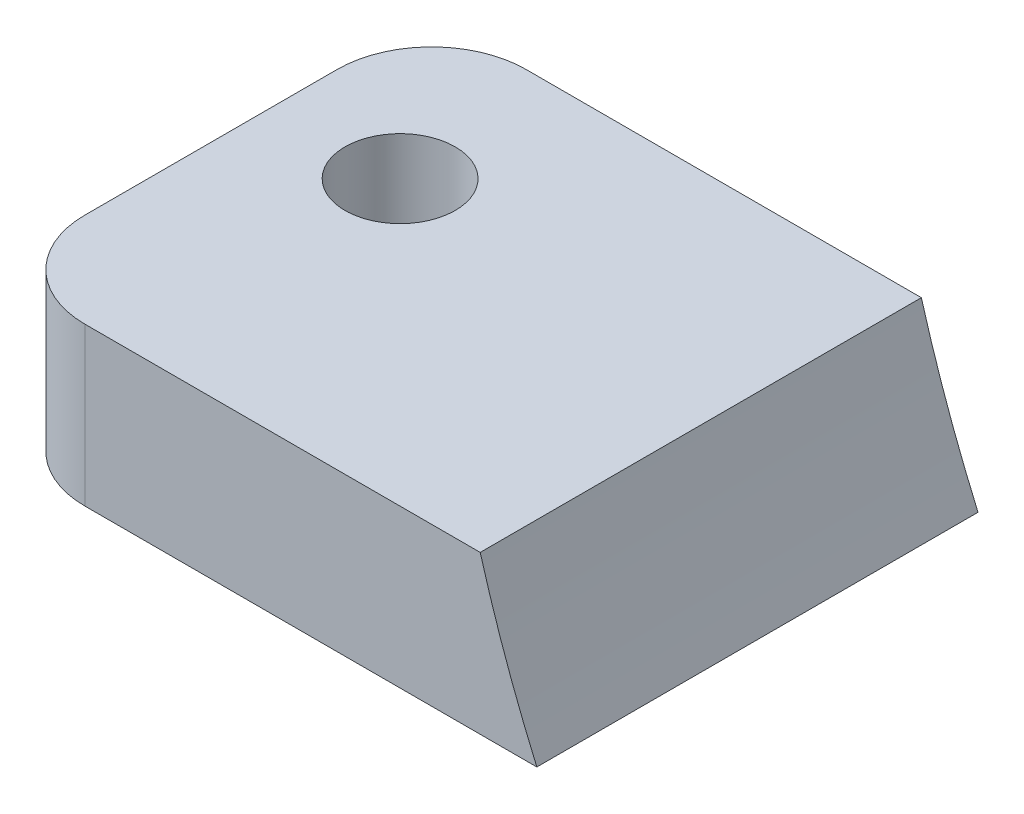
ISO-10303-21;
HEADER;
FILE_DESCRIPTION(('STEP AP214'),'2;1');
FILE_NAME('part.step','',(''),(''),'','','');
FILE_SCHEMA(('AUTOMOTIVE_DESIGN { 1 0 10303 214 1 1 1 1 }'));
ENDSEC;
DATA;
#1=APPLICATION_CONTEXT('core data for automotive mechanical design processes');
#2=APPLICATION_PROTOCOL_DEFINITION('international standard','automotive_design',2000,#1);
#3=PRODUCT_CONTEXT('',#1,'mechanical');
#4=PRODUCT('Part','Part','',(#3));
#5=PRODUCT_RELATED_PRODUCT_CATEGORY('part','',(#4));
#6=PRODUCT_DEFINITION_FORMATION('','',#4);
#7=PRODUCT_DEFINITION_CONTEXT('part definition',#1,'design');
#8=PRODUCT_DEFINITION('design','',#6,#7);
#9=PRODUCT_DEFINITION_SHAPE('','',#8);
#10=(LENGTH_UNIT() NAMED_UNIT(*) SI_UNIT(.MILLI.,.METRE.));
#11=(NAMED_UNIT(*) PLANE_ANGLE_UNIT() SI_UNIT($,.RADIAN.));
#12=(NAMED_UNIT(*) SI_UNIT($,.STERADIAN.) SOLID_ANGLE_UNIT());
#13=UNCERTAINTY_MEASURE_WITH_UNIT(LENGTH_MEASURE(1.E-05),#10,'distance_accuracy_value','');
#14=(GEOMETRIC_REPRESENTATION_CONTEXT(3) GLOBAL_UNCERTAINTY_ASSIGNED_CONTEXT((#13)) GLOBAL_UNIT_ASSIGNED_CONTEXT((#10,
#11,#12)) REPRESENTATION_CONTEXT('',''));
#15=CARTESIAN_POINT('',(0.,0.,0.));
#16=DIRECTION('',(0.,0.,1.));
#17=DIRECTION('',(1.,0.,0.));
#18=AXIS2_PLACEMENT_3D('',#15,#16,#17);
#19=CARTESIAN_POINT('',(0.,0.,0.));
#20=DIRECTION('',(0.,0.,1.));
#21=DIRECTION('',(1.,0.,0.));
#22=AXIS2_PLACEMENT_3D('',#19,#20,#21);
#23=PLANE('',#22);
#24=DIRECTION('',(-1.,0.,0.));
#25=VECTOR('',#24,1.);
#26=CARTESIAN_POINT('',(72.001,-11.,0.));
#27=LINE('',#26,#25);
#28=CARTESIAN_POINT('',(-38.4577690460588,-11.,0.));
#29=VERTEX_POINT('',#28);
#30=CARTESIAN_POINT('',(-51.,-11.,0.));
#31=VERTEX_POINT('',#30);
#32=EDGE_CURVE('E110',#29,#31,#27,.T.);
#33=ORIENTED_EDGE('',*,*,#32,.F.);
#34=CARTESIAN_POINT('',(0.,0.,0.));
#35=DIRECTION('',(0.,0.,1.));
#36=DIRECTION('',(1.,0.,0.));
#37=AXIS2_PLACEMENT_3D('',#34,#35,#36);
#38=CIRCLE('',#37,40.);
#39=CARTESIAN_POINT('',(-36.6606055596467,-16.,0.));
#40=VERTEX_POINT('',#39);
#41=EDGE_CURVE('E94',#29,#40,#38,.T.);
#42=ORIENTED_EDGE('',*,*,#41,.T.);
#43=DIRECTION('',(-1.,0.,0.));
#44=VECTOR('',#43,1.);
#45=CARTESIAN_POINT('',(72.001,-16.,0.));
#46=LINE('',#45,#44);
#47=CARTESIAN_POINT('',(-51.,-16.,0.));
#48=VERTEX_POINT('',#47);
#49=EDGE_CURVE('E107',#40,#48,#46,.T.);
#50=ORIENTED_EDGE('',*,*,#49,.T.);
#51=DIRECTION('',(0.,1.,0.));
#52=VECTOR('',#51,1.);
#53=CARTESIAN_POINT('',(-51.,0.,0.));
#54=LINE('',#53,#52);
#55=EDGE_CURVE('E124',#48,#31,#54,.T.);
#56=ORIENTED_EDGE('',*,*,#55,.T.);
#57=EDGE_LOOP('',(#33,#42,#50,#56));
#58=FACE_BOUND('',#57,.T.);
#59=ADVANCED_FACE('F37',(#58),#23,.F.);
#60=CARTESIAN_POINT('',(72.001,-11.,14.));
#61=DIRECTION('',(0.,0.,-1.));
#62=DIRECTION('',(0.,1.,0.));
#63=AXIS2_PLACEMENT_3D('',#60,#61,#62);
#64=PLANE('',#63);
#65=DIRECTION('',(-1.,0.,0.));
#66=VECTOR('',#65,1.);
#67=CARTESIAN_POINT('',(72.001,-11.,14.));
#68=LINE('',#67,#66);
#69=CARTESIAN_POINT('',(-38.4577690460588,-11.,14.));
#70=VERTEX_POINT('',#69);
#71=CARTESIAN_POINT('',(-51.,-11.,14.));
#72=VERTEX_POINT('',#71);
#73=EDGE_CURVE('E118',#70,#72,#68,.T.);
#74=ORIENTED_EDGE('',*,*,#73,.T.);
#75=DIRECTION('',(0.,-1.,0.));
#76=VECTOR('',#75,1.);
#77=CARTESIAN_POINT('',(-51.,-11.,14.));
#78=LINE('',#77,#76);
#79=CARTESIAN_POINT('',(-51.,-16.,14.));
#80=VERTEX_POINT('',#79);
#81=EDGE_CURVE('E11',#72,#80,#78,.T.);
#82=ORIENTED_EDGE('',*,*,#81,.T.);
#83=DIRECTION('',(-1.,0.,0.));
#84=VECTOR('',#83,1.);
#85=CARTESIAN_POINT('',(72.001,-16.,14.));
#86=LINE('',#85,#84);
#87=CARTESIAN_POINT('',(-36.6606055596467,-16.,14.));
#88=VERTEX_POINT('',#87);
#89=EDGE_CURVE('E102',#88,#80,#86,.T.);
#90=ORIENTED_EDGE('',*,*,#89,.F.);
#91=CARTESIAN_POINT('',(0.,0.,14.));
#92=DIRECTION('',(0.,0.,-1.));
#93=DIRECTION('',(0.,1.,0.));
#94=AXIS2_PLACEMENT_3D('',#91,#92,#93);
#95=CIRCLE('',#94,40.);
#96=EDGE_CURVE('E97',#70,#88,#95,.F.);
#97=ORIENTED_EDGE('',*,*,#96,.F.);
#98=EDGE_LOOP('',(#74,#82,#90,#97));
#99=FACE_BOUND('',#98,.T.);
#100=ADVANCED_FACE('F145',(#99),#64,.F.);
#101=CARTESIAN_POINT('',(72.001,-16.,14.));
#102=DIRECTION('',(0.,1.,0.));
#103=DIRECTION('',(0.,0.,1.));
#104=AXIS2_PLACEMENT_3D('',#101,#102,#103);
#105=PLANE('',#104);
#106=CARTESIAN_POINT('',(-50.,-16.,5.));
#107=DIRECTION('',(0.,-1.,0.));
#108=DIRECTION('',(0.,0.,-1.));
#109=AXIS2_PLACEMENT_3D('',#106,#107,#108);
#110=CIRCLE('',#109,1.75);
#111=CARTESIAN_POINT('',(-50.,-16.,3.25));
#112=VERTEX_POINT('',#111);
#113=EDGE_CURVE('E112',#112,#112,#110,.T.);
#114=ORIENTED_EDGE('',*,*,#113,.F.);
#115=EDGE_LOOP('',(#114));
#116=FACE_BOUND('',#115,.T.);
#117=DIRECTION('',(0.,0.,-1.));
#118=VECTOR('',#117,1.);
#119=CARTESIAN_POINT('',(-54.,-16.,14.));
#120=LINE('',#119,#118);
#121=CARTESIAN_POINT('',(-54.,-16.,11.));
#122=VERTEX_POINT('',#121);
#123=CARTESIAN_POINT('',(-54.,-16.,3.));
#124=VERTEX_POINT('',#123);
#125=EDGE_CURVE('E133',#122,#124,#120,.T.);
#126=ORIENTED_EDGE('',*,*,#125,.T.);
#127=CARTESIAN_POINT('',(-51.,-16.,3.));
#128=DIRECTION('',(0.,1.,0.));
#129=DIRECTION('',(0.,0.,1.));
#130=AXIS2_PLACEMENT_3D('',#127,#128,#129);
#131=CIRCLE('',#130,3.);
#132=EDGE_CURVE('E45',#124,#48,#131,.F.);
#133=ORIENTED_EDGE('',*,*,#132,.T.);
#134=ORIENTED_EDGE('',*,*,#49,.F.);
#135=DIRECTION('',(0.,0.,-1.));
#136=VECTOR('',#135,1.);
#137=CARTESIAN_POINT('',(-36.6606055596467,-16.,200.));
#138=LINE('',#137,#136);
#139=EDGE_CURVE('E91',#88,#40,#138,.T.);
#140=ORIENTED_EDGE('',*,*,#139,.F.);
#141=ORIENTED_EDGE('',*,*,#89,.T.);
#142=CARTESIAN_POINT('',(-51.,-16.,11.));
#143=DIRECTION('',(0.,1.,0.));
#144=DIRECTION('',(0.,0.,1.));
#145=AXIS2_PLACEMENT_3D('',#142,#143,#144);
#146=CIRCLE('',#145,3.);
#147=EDGE_CURVE('E52',#80,#122,#146,.F.);
#148=ORIENTED_EDGE('',*,*,#147,.T.);
#149=EDGE_LOOP('',(#126,#133,#134,#140,#141,#148));
#150=FACE_BOUND('',#149,.T.);
#151=ADVANCED_FACE('F114',(#116,#150),#105,.F.);
#152=CARTESIAN_POINT('',(72.001,-11.,14.));
#153=DIRECTION('',(0.,-1.,0.));
#154=DIRECTION('',(0.,0.,-1.));
#155=AXIS2_PLACEMENT_3D('',#152,#153,#154);
#156=PLANE('',#155);
#157=CARTESIAN_POINT('',(-50.,-11.,5.));
#158=DIRECTION('',(0.,-1.,0.));
#159=DIRECTION('',(0.,0.,-1.));
#160=AXIS2_PLACEMENT_3D('',#157,#158,#159);
#161=CIRCLE('',#160,1.75);
#162=CARTESIAN_POINT('',(-50.,-11.,3.25));
#163=VERTEX_POINT('',#162);
#164=EDGE_CURVE('E137',#163,#163,#161,.T.);
#165=ORIENTED_EDGE('',*,*,#164,.T.);
#166=EDGE_LOOP('',(#165));
#167=FACE_BOUND('',#166,.T.);
#168=ORIENTED_EDGE('',*,*,#32,.T.);
#169=CARTESIAN_POINT('',(-51.,-11.,3.));
#170=DIRECTION('',(0.,-1.,0.));
#171=DIRECTION('',(0.,0.,-1.));
#172=AXIS2_PLACEMENT_3D('',#169,#170,#171);
#173=CIRCLE('',#172,3.);
#174=CARTESIAN_POINT('',(-54.,-11.,3.));
#175=VERTEX_POINT('',#174);
#176=EDGE_CURVE('E128',#31,#175,#173,.F.);
#177=ORIENTED_EDGE('',*,*,#176,.T.);
#178=DIRECTION('',(0.,0.,1.));
#179=VECTOR('',#178,1.);
#180=CARTESIAN_POINT('',(-54.,-11.,14.));
#181=LINE('',#180,#179);
#182=CARTESIAN_POINT('',(-54.,-11.,11.));
#183=VERTEX_POINT('',#182);
#184=EDGE_CURVE('E136',#175,#183,#181,.T.);
#185=ORIENTED_EDGE('',*,*,#184,.T.);
#186=CARTESIAN_POINT('',(-51.,-11.,11.));
#187=DIRECTION('',(0.,-1.,0.));
#188=DIRECTION('',(0.,0.,-1.));
#189=AXIS2_PLACEMENT_3D('',#186,#187,#188);
#190=CIRCLE('',#189,3.);
#191=EDGE_CURVE('E126',#183,#72,#190,.F.);
#192=ORIENTED_EDGE('',*,*,#191,.T.);
#193=ORIENTED_EDGE('',*,*,#73,.F.);
#194=DIRECTION('',(0.,0.,-1.));
#195=VECTOR('',#194,1.);
#196=CARTESIAN_POINT('',(-38.4577690460588,-11.0000000000001,200.));
#197=LINE('',#196,#195);
#198=EDGE_CURVE('E122',#29,#70,#197,.F.);
#199=ORIENTED_EDGE('',*,*,#198,.F.);
#200=EDGE_LOOP('',(#168,#177,#185,#192,#193,#199));
#201=FACE_BOUND('',#200,.T.);
#202=ADVANCED_FACE('F143',(#167,#201),#156,.F.);
#203=CARTESIAN_POINT('',(-54.,0.,0.));
#204=DIRECTION('',(1.,0.,0.));
#205=DIRECTION('',(0.,0.,-1.));
#206=AXIS2_PLACEMENT_3D('',#203,#204,#205);
#207=PLANE('',#206);
#208=ORIENTED_EDGE('',*,*,#184,.F.);
#209=DIRECTION('',(0.,1.,0.));
#210=VECTOR('',#209,1.);
#211=CARTESIAN_POINT('',(-54.,0.,3.));
#212=LINE('',#211,#210);
#213=EDGE_CURVE('E59',#175,#124,#212,.F.);
#214=ORIENTED_EDGE('',*,*,#213,.T.);
#215=ORIENTED_EDGE('',*,*,#125,.F.);
#216=DIRECTION('',(0.,-1.,0.));
#217=VECTOR('',#216,1.);
#218=CARTESIAN_POINT('',(-54.,0.,11.));
#219=LINE('',#218,#217);
#220=EDGE_CURVE('E130',#122,#183,#219,.F.);
#221=ORIENTED_EDGE('',*,*,#220,.T.);
#222=EDGE_LOOP('',(#208,#214,#215,#221));
#223=FACE_BOUND('',#222,.T.);
#224=ADVANCED_FACE('F134',(#223),#207,.F.);
#225=CARTESIAN_POINT('',(-50.,20.9497474683059,4.99999999999999));
#226=DIRECTION('',(0.,-1.,0.));
#227=DIRECTION('',(0.,0.,-1.));
#228=AXIS2_PLACEMENT_3D('',#225,#226,#227);
#229=CYLINDRICAL_SURFACE('',#228,1.75);
#230=ORIENTED_EDGE('',*,*,#113,.T.);
#231=EDGE_LOOP('',(#230));
#232=FACE_BOUND('',#231,.T.);
#233=ORIENTED_EDGE('',*,*,#164,.F.);
#234=EDGE_LOOP('',(#233));
#235=FACE_BOUND('',#234,.T.);
#236=ADVANCED_FACE('F154',(#232,#235),#229,.F.);
#237=CARTESIAN_POINT('',(-51.,0.,3.));
#238=DIRECTION('',(0.,1.,0.));
#239=DIRECTION('',(0.,0.,1.));
#240=AXIS2_PLACEMENT_3D('',#237,#238,#239);
#241=CYLINDRICAL_SURFACE('',#240,3.);
#242=ORIENTED_EDGE('',*,*,#132,.F.);
#243=ORIENTED_EDGE('',*,*,#213,.F.);
#244=ORIENTED_EDGE('',*,*,#176,.F.);
#245=ORIENTED_EDGE('',*,*,#55,.F.);
#246=EDGE_LOOP('',(#242,#243,#244,#245));
#247=FACE_BOUND('',#246,.T.);
#248=ADVANCED_FACE('F170',(#247),#241,.T.);
#249=CARTESIAN_POINT('',(-51.,-11.,11.));
#250=DIRECTION('',(0.,-1.,0.));
#251=DIRECTION('',(0.,0.,-1.));
#252=AXIS2_PLACEMENT_3D('',#249,#250,#251);
#253=CYLINDRICAL_SURFACE('',#252,3.);
#254=ORIENTED_EDGE('',*,*,#191,.F.);
#255=ORIENTED_EDGE('',*,*,#220,.F.);
#256=ORIENTED_EDGE('',*,*,#147,.F.);
#257=ORIENTED_EDGE('',*,*,#81,.F.);
#258=EDGE_LOOP('',(#254,#255,#256,#257));
#259=FACE_BOUND('',#258,.T.);
#260=ADVANCED_FACE('F39',(#259),#253,.T.);
#261=CARTESIAN_POINT('',(0.,0.,-2.001));
#262=DIRECTION('',(0.,0.,1.));
#263=DIRECTION('',(1.,0.,0.));
#264=AXIS2_PLACEMENT_3D('',#261,#262,#263);
#265=CYLINDRICAL_SURFACE('',#264,40.);
#266=ORIENTED_EDGE('',*,*,#41,.F.);
#267=ORIENTED_EDGE('',*,*,#198,.T.);
#268=ORIENTED_EDGE('',*,*,#96,.T.);
#269=ORIENTED_EDGE('',*,*,#139,.T.);
#270=EDGE_LOOP('',(#266,#267,#268,#269));
#271=FACE_BOUND('',#270,.T.);
#272=ADVANCED_FACE('F93',(#271),#265,.F.);
#273=CLOSED_SHELL('',(#59,#100,#151,#202,#224,#236,#248,#260,#272));
#274=MANIFOLD_SOLID_BREP('B2',#273);
#275=ADVANCED_BREP_SHAPE_REPRESENTATION('',(#18,#274),#14);
#276=SHAPE_DEFINITION_REPRESENTATION(#9,#275);
ENDSEC;
END-ISO-10303-21;
